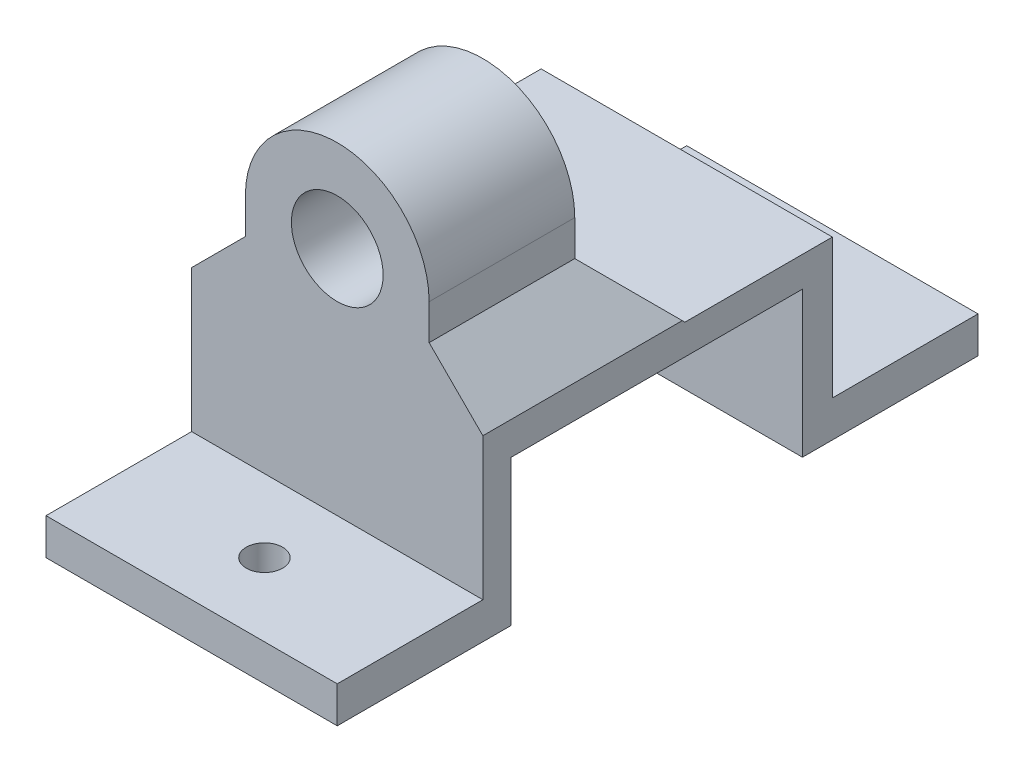
ISO-10303-21;
HEADER;
FILE_DESCRIPTION(('STEP AP214'),'2;1');
FILE_NAME('part.step','',(''),(''),'','','');
FILE_SCHEMA(('AUTOMOTIVE_DESIGN { 1 0 10303 214 1 1 1 1 }'));
ENDSEC;
DATA;
#1=APPLICATION_CONTEXT('core data for automotive mechanical design processes');
#2=APPLICATION_PROTOCOL_DEFINITION('international standard','automotive_design',2000,#1);
#3=PRODUCT_CONTEXT('',#1,'mechanical');
#4=PRODUCT('Part','Part','',(#3));
#5=PRODUCT_RELATED_PRODUCT_CATEGORY('part','',(#4));
#6=PRODUCT_DEFINITION_FORMATION('','',#4);
#7=PRODUCT_DEFINITION_CONTEXT('part definition',#1,'design');
#8=PRODUCT_DEFINITION('design','',#6,#7);
#9=PRODUCT_DEFINITION_SHAPE('','',#8);
#10=(LENGTH_UNIT() NAMED_UNIT(*) SI_UNIT(.MILLI.,.METRE.));
#11=(NAMED_UNIT(*) PLANE_ANGLE_UNIT() SI_UNIT($,.RADIAN.));
#12=(NAMED_UNIT(*) SI_UNIT($,.STERADIAN.) SOLID_ANGLE_UNIT());
#13=UNCERTAINTY_MEASURE_WITH_UNIT(LENGTH_MEASURE(1.E-05),#10,'distance_accuracy_value','');
#14=(GEOMETRIC_REPRESENTATION_CONTEXT(3) GLOBAL_UNCERTAINTY_ASSIGNED_CONTEXT((#13)) GLOBAL_UNIT_ASSIGNED_CONTEXT((#10,
#11,#12)) REPRESENTATION_CONTEXT('',''));
#15=CARTESIAN_POINT('',(0.,0.,0.));
#16=DIRECTION('',(0.,0.,1.));
#17=DIRECTION('',(1.,0.,0.));
#18=AXIS2_PLACEMENT_3D('',#15,#16,#17);
#19=CARTESIAN_POINT('',(25.4,15.4293953995697,-15.3076613058219));
#20=DIRECTION('',(0.,-1.,0.));
#21=DIRECTION('',(0.,0.,-1.));
#22=AXIS2_PLACEMENT_3D('',#19,#20,#21);
#23=PLANE('',#22);
#24=DIRECTION('',(0.,0.,1.));
#25=VECTOR('',#24,1.);
#26=CARTESIAN_POINT('',(0.,15.4293953995697,-15.3076613058219));
#27=LINE('',#26,#25);
#28=CARTESIAN_POINT('',(0.,15.4293953995697,-15.3076613058219));
#29=VERTEX_POINT('',#28);
#30=CARTESIAN_POINT('',(0.,15.4293953995697,-2.44766130582202));
#31=VERTEX_POINT('',#30);
#32=EDGE_CURVE('E278',#29,#31,#27,.T.);
#33=ORIENTED_EDGE('',*,*,#32,.T.);
#34=DIRECTION('',(1.,0.,0.));
#35=VECTOR('',#34,1.);
#36=CARTESIAN_POINT('',(25.4,15.4293953995697,-2.44766130582202));
#37=LINE('',#36,#35);
#38=CARTESIAN_POINT('',(25.4,15.4293953995697,-2.44766130582202));
#39=VERTEX_POINT('',#38);
#40=EDGE_CURVE('E359',#31,#39,#37,.T.);
#41=ORIENTED_EDGE('',*,*,#40,.T.);
#42=DIRECTION('',(0.,0.,1.));
#43=VECTOR('',#42,1.);
#44=CARTESIAN_POINT('',(25.4,15.4293953995697,-15.3076613058219));
#45=LINE('',#44,#43);
#46=CARTESIAN_POINT('',(25.4,15.4293953995697,-15.3076613058219));
#47=VERTEX_POINT('',#46);
#48=EDGE_CURVE('E240',#47,#39,#45,.T.);
#49=ORIENTED_EDGE('',*,*,#48,.F.);
#50=DIRECTION('',(-1.,0.,0.));
#51=VECTOR('',#50,1.);
#52=CARTESIAN_POINT('',(25.4,15.4293953995697,-15.3076613058219));
#53=LINE('',#52,#51);
#54=EDGE_CURVE('E322',#47,#29,#53,.T.);
#55=ORIENTED_EDGE('',*,*,#54,.T.);
#56=EDGE_LOOP('',(#33,#41,#49,#55));
#57=FACE_BOUND('',#56,.T.);
#58=ADVANCED_FACE('F43',(#57),#23,.F.);
#59=CARTESIAN_POINT('',(25.4,12.800996681316,-12.7));
#60=DIRECTION('',(0.,0.,-1.));
#61=DIRECTION('',(0.,1.,0.));
#62=AXIS2_PLACEMENT_3D('',#59,#60,#61);
#63=PLANE('',#62);
#64=DIRECTION('',(0.,-1.,0.));
#65=VECTOR('',#64,1.);
#66=CARTESIAN_POINT('',(0.,12.800996681316,-12.7));
#67=LINE('',#66,#65);
#68=CARTESIAN_POINT('',(0.,12.800996681316,-12.7));
#69=VERTEX_POINT('',#68);
#70=CARTESIAN_POINT('',(0.,0.100996681315959,-12.7));
#71=VERTEX_POINT('',#70);
#72=EDGE_CURVE('E221',#69,#71,#67,.T.);
#73=ORIENTED_EDGE('',*,*,#72,.T.);
#74=DIRECTION('',(-1.,0.,0.));
#75=VECTOR('',#74,1.);
#76=CARTESIAN_POINT('',(25.4,0.100996681315959,-12.7));
#77=LINE('',#76,#75);
#78=CARTESIAN_POINT('',(25.4,0.100996681315959,-12.7));
#79=VERTEX_POINT('',#78);
#80=EDGE_CURVE('E338',#79,#71,#77,.T.);
#81=ORIENTED_EDGE('',*,*,#80,.F.);
#82=DIRECTION('',(0.,-1.,0.));
#83=VECTOR('',#82,1.);
#84=CARTESIAN_POINT('',(25.4,12.800996681316,-12.7));
#85=LINE('',#84,#83);
#86=CARTESIAN_POINT('',(25.4,12.800996681316,-12.7));
#87=VERTEX_POINT('',#86);
#88=EDGE_CURVE('E223',#87,#79,#85,.T.);
#89=ORIENTED_EDGE('',*,*,#88,.F.);
#90=DIRECTION('',(-1.,0.,0.));
#91=VECTOR('',#90,1.);
#92=CARTESIAN_POINT('',(25.4,12.800996681316,-12.7));
#93=LINE('',#92,#91);
#94=EDGE_CURVE('E262',#87,#69,#93,.T.);
#95=ORIENTED_EDGE('',*,*,#94,.T.);
#96=EDGE_LOOP('',(#73,#81,#89,#95));
#97=FACE_BOUND('',#96,.T.);
#98=ADVANCED_FACE('F415',(#97),#63,.F.);
#99=CARTESIAN_POINT('',(25.4,0.100996681315959,-12.7));
#100=DIRECTION('',(0.,1.,0.));
#101=DIRECTION('',(0.,0.,1.));
#102=AXIS2_PLACEMENT_3D('',#99,#100,#101);
#103=PLANE('',#102);
#104=CARTESIAN_POINT('',(12.7,0.100996681315961,-21.6576613058219));
#105=DIRECTION('',(0.,1.,0.));
#106=DIRECTION('',(0.,0.,1.));
#107=AXIS2_PLACEMENT_3D('',#104,#105,#106);
#108=CIRCLE('',#107,1.5875);
#109=CARTESIAN_POINT('',(12.7,0.100996681315961,-20.0701613058219));
#110=VERTEX_POINT('',#109);
#111=EDGE_CURVE('E459',#110,#110,#108,.T.);
#112=ORIENTED_EDGE('',*,*,#111,.T.);
#113=EDGE_LOOP('',(#112));
#114=FACE_BOUND('',#113,.T.);
#115=DIRECTION('',(0.,0.,-1.));
#116=VECTOR('',#115,1.);
#117=CARTESIAN_POINT('',(0.,0.100996681315959,-12.7));
#118=LINE('',#117,#116);
#119=CARTESIAN_POINT('',(0.,0.100996681315963,-28.0076613058219));
#120=VERTEX_POINT('',#119);
#121=EDGE_CURVE('E266',#71,#120,#118,.T.);
#122=ORIENTED_EDGE('',*,*,#121,.T.);
#123=DIRECTION('',(-1.,0.,0.));
#124=VECTOR('',#123,1.);
#125=CARTESIAN_POINT('',(25.4,0.100996681315963,-28.0076613058219));
#126=LINE('',#125,#124);
#127=CARTESIAN_POINT('',(25.4,0.100996681315963,-28.0076613058219));
#128=VERTEX_POINT('',#127);
#129=EDGE_CURVE('E334',#128,#120,#126,.T.);
#130=ORIENTED_EDGE('',*,*,#129,.F.);
#131=DIRECTION('',(0.,0.,-1.));
#132=VECTOR('',#131,1.);
#133=CARTESIAN_POINT('',(25.4,0.100996681315959,-12.7));
#134=LINE('',#133,#132);
#135=EDGE_CURVE('E227',#79,#128,#134,.T.);
#136=ORIENTED_EDGE('',*,*,#135,.F.);
#137=ORIENTED_EDGE('',*,*,#80,.T.);
#138=EDGE_LOOP('',(#122,#130,#136,#137));
#139=FACE_BOUND('',#138,.T.);
#140=ADVANCED_FACE('F410',(#114,#139),#103,.F.);
#141=CARTESIAN_POINT('',(25.4,3.27599668131595,-28.0076613058219));
#142=DIRECTION('',(0.,0.,1.));
#143=DIRECTION('',(1.,0.,0.));
#144=AXIS2_PLACEMENT_3D('',#141,#142,#143);
#145=PLANE('',#144);
#146=DIRECTION('',(0.,1.,0.));
#147=VECTOR('',#146,1.);
#148=CARTESIAN_POINT('',(0.,3.27599668131595,-28.0076613058219));
#149=LINE('',#148,#147);
#150=CARTESIAN_POINT('',(0.,3.27599668131595,-28.0076613058219));
#151=VERTEX_POINT('',#150);
#152=EDGE_CURVE('E269',#120,#151,#149,.T.);
#153=ORIENTED_EDGE('',*,*,#152,.T.);
#154=DIRECTION('',(-1.,0.,0.));
#155=VECTOR('',#154,1.);
#156=CARTESIAN_POINT('',(25.4,3.27599668131595,-28.0076613058219));
#157=LINE('',#156,#155);
#158=CARTESIAN_POINT('',(25.4,3.27599668131595,-28.0076613058219));
#159=VERTEX_POINT('',#158);
#160=EDGE_CURVE('E330',#159,#151,#157,.T.);
#161=ORIENTED_EDGE('',*,*,#160,.F.);
#162=DIRECTION('',(0.,1.,0.));
#163=VECTOR('',#162,1.);
#164=CARTESIAN_POINT('',(25.4,3.27599668131595,-28.0076613058219));
#165=LINE('',#164,#163);
#166=EDGE_CURVE('E231',#128,#159,#165,.T.);
#167=ORIENTED_EDGE('',*,*,#166,.F.);
#168=ORIENTED_EDGE('',*,*,#129,.T.);
#169=EDGE_LOOP('',(#153,#161,#167,#168));
#170=FACE_BOUND('',#169,.T.);
#171=ADVANCED_FACE('F407',(#170),#145,.F.);
#172=CARTESIAN_POINT('',(25.4,3.27599668131595,-15.3076613058219));
#173=DIRECTION('',(0.,-1.,0.));
#174=DIRECTION('',(0.,0.,-1.));
#175=AXIS2_PLACEMENT_3D('',#172,#173,#174);
#176=PLANE('',#175);
#177=CARTESIAN_POINT('',(12.7,3.27599668131595,-21.6576613058219));
#178=DIRECTION('',(0.,1.,0.));
#179=DIRECTION('',(0.,0.,1.));
#180=AXIS2_PLACEMENT_3D('',#177,#178,#179);
#181=CIRCLE('',#180,1.5875);
#182=CARTESIAN_POINT('',(12.7,3.27599668131595,-20.0701613058219));
#183=VERTEX_POINT('',#182);
#184=EDGE_CURVE('E468',#183,#183,#181,.T.);
#185=ORIENTED_EDGE('',*,*,#184,.F.);
#186=EDGE_LOOP('',(#185));
#187=FACE_BOUND('',#186,.T.);
#188=DIRECTION('',(0.,0.,1.));
#189=VECTOR('',#188,1.);
#190=CARTESIAN_POINT('',(0.,3.27599668131595,-15.3076613058219));
#191=LINE('',#190,#189);
#192=CARTESIAN_POINT('',(0.,3.27599668131595,-15.3076613058219));
#193=VERTEX_POINT('',#192);
#194=EDGE_CURVE('E272',#151,#193,#191,.T.);
#195=ORIENTED_EDGE('',*,*,#194,.T.);
#196=DIRECTION('',(-1.,0.,0.));
#197=VECTOR('',#196,1.);
#198=CARTESIAN_POINT('',(25.4,3.27599668131595,-15.3076613058219));
#199=LINE('',#198,#197);
#200=CARTESIAN_POINT('',(25.4,3.27599668131595,-15.3076613058219));
#201=VERTEX_POINT('',#200);
#202=EDGE_CURVE('E326',#201,#193,#199,.T.);
#203=ORIENTED_EDGE('',*,*,#202,.F.);
#204=DIRECTION('',(0.,0.,1.));
#205=VECTOR('',#204,1.);
#206=CARTESIAN_POINT('',(25.4,3.27599668131595,-15.3076613058219));
#207=LINE('',#206,#205);
#208=EDGE_CURVE('E234',#159,#201,#207,.T.);
#209=ORIENTED_EDGE('',*,*,#208,.F.);
#210=ORIENTED_EDGE('',*,*,#160,.T.);
#211=EDGE_LOOP('',(#195,#203,#209,#210));
#212=FACE_BOUND('',#211,.T.);
#213=ADVANCED_FACE('F402',(#187,#212),#176,.F.);
#214=CARTESIAN_POINT('',(25.4,15.4293953995697,-15.3076613058219));
#215=DIRECTION('',(0.,0.,1.));
#216=DIRECTION('',(1.,0.,0.));
#217=AXIS2_PLACEMENT_3D('',#214,#215,#216);
#218=PLANE('',#217);
#219=DIRECTION('',(0.,1.,0.));
#220=VECTOR('',#219,1.);
#221=CARTESIAN_POINT('',(0.,15.4293953995697,-15.3076613058219));
#222=LINE('',#221,#220);
#223=EDGE_CURVE('E275',#193,#29,#222,.T.);
#224=ORIENTED_EDGE('',*,*,#223,.T.);
#225=ORIENTED_EDGE('',*,*,#54,.F.);
#226=DIRECTION('',(0.,1.,0.));
#227=VECTOR('',#226,1.);
#228=CARTESIAN_POINT('',(25.4,15.4293953995697,-15.3076613058219));
#229=LINE('',#228,#227);
#230=EDGE_CURVE('E237',#201,#47,#229,.T.);
#231=ORIENTED_EDGE('',*,*,#230,.F.);
#232=ORIENTED_EDGE('',*,*,#202,.T.);
#233=EDGE_LOOP('',(#224,#225,#231,#232));
#234=FACE_BOUND('',#233,.T.);
#235=ADVANCED_FACE('F397',(#234),#218,.F.);
#236=CARTESIAN_POINT('',(25.4,15.4293953995697,15.1723386941781));
#237=DIRECTION('',(0.,0.,-1.));
#238=DIRECTION('',(-1.,0.,0.));
#239=AXIS2_PLACEMENT_3D('',#236,#237,#238);
#240=PLANE('',#239);
#241=DIRECTION('',(0.,-1.,0.));
#242=VECTOR('',#241,1.);
#243=CARTESIAN_POINT('',(0.,15.4293953995697,15.1723386941781));
#244=LINE('',#243,#242);
#245=CARTESIAN_POINT('',(0.,15.6622744756869,15.1723386941781));
#246=VERTEX_POINT('',#245);
#247=CARTESIAN_POINT('',(0.,3.27599668131595,15.1723386941781));
#248=VERTEX_POINT('',#247);
#249=EDGE_CURVE('E282',#246,#248,#244,.T.);
#250=ORIENTED_EDGE('',*,*,#249,.T.);
#251=DIRECTION('',(-1.,0.,0.));
#252=VECTOR('',#251,1.);
#253=CARTESIAN_POINT('',(25.4,3.27599668131595,15.1723386941781));
#254=LINE('',#253,#252);
#255=CARTESIAN_POINT('',(25.4,3.27599668131595,15.1723386941781));
#256=VERTEX_POINT('',#255);
#257=EDGE_CURVE('E318',#256,#248,#254,.T.);
#258=ORIENTED_EDGE('',*,*,#257,.F.);
#259=DIRECTION('',(0.,-1.,0.));
#260=VECTOR('',#259,1.);
#261=CARTESIAN_POINT('',(25.4,15.4293953995697,15.1723386941781));
#262=LINE('',#261,#260);
#263=CARTESIAN_POINT('',(25.4,15.662274475687,15.1723386941781));
#264=VERTEX_POINT('',#263);
#265=EDGE_CURVE('E244',#264,#256,#262,.T.);
#266=ORIENTED_EDGE('',*,*,#265,.F.);
#267=DIRECTION('',(-0.707106781186552,0.707106781186543,0.));
#268=VECTOR('',#267,1.);
#269=CARTESIAN_POINT('',(25.5164395380586,15.5458349376283,15.1723386941781));
#270=LINE('',#269,#268);
#271=CARTESIAN_POINT('',(20.7128790761172,20.3493953995697,15.1723386941781));
#272=VERTEX_POINT('',#271);
#273=EDGE_CURVE('E356',#264,#272,#270,.T.);
#274=ORIENTED_EDGE('',*,*,#273,.T.);
#275=DIRECTION('',(0.,1.,0.));
#276=VECTOR('',#275,1.);
#277=CARTESIAN_POINT('',(20.7128790761172,23.4422744756869,15.1723386941781));
#278=LINE('',#277,#276);
#279=CARTESIAN_POINT('',(20.7128790761172,23.4422744756869,15.1723386941781));
#280=VERTEX_POINT('',#279);
#281=EDGE_CURVE('E211',#272,#280,#278,.T.);
#282=ORIENTED_EDGE('',*,*,#281,.T.);
#283=CARTESIAN_POINT('',(12.7,23.4422744756869,15.1723386941781));
#284=DIRECTION('',(0.,0.,1.));
#285=DIRECTION('',(1.,0.,0.));
#286=AXIS2_PLACEMENT_3D('',#283,#284,#285);
#287=CIRCLE('',#286,8.01287907611717);
#288=CARTESIAN_POINT('',(4.68712092388283,23.4422744756869,15.1723386941781));
#289=VERTEX_POINT('',#288);
#290=EDGE_CURVE('E197',#280,#289,#287,.T.);
#291=ORIENTED_EDGE('',*,*,#290,.T.);
#292=DIRECTION('',(0.,-1.,0.));
#293=VECTOR('',#292,1.);
#294=CARTESIAN_POINT('',(4.68712092388283,23.4422744756869,15.1723386941781));
#295=LINE('',#294,#293);
#296=CARTESIAN_POINT('',(4.68712092388283,20.3493953995698,15.1723386941781));
#297=VERTEX_POINT('',#296);
#298=EDGE_CURVE('E191',#289,#297,#295,.T.);
#299=ORIENTED_EDGE('',*,*,#298,.T.);
#300=DIRECTION('',(-0.707106781186544,-0.707106781186551,0.));
#301=VECTOR('',#300,1.);
#302=CARTESIAN_POINT('',(12.5835604619413,28.2458349376283,15.1723386941781));
#303=LINE('',#302,#301);
#304=EDGE_CURVE('E348',#297,#246,#303,.T.);
#305=ORIENTED_EDGE('',*,*,#304,.T.);
#306=EDGE_LOOP('',(#250,#258,#266,#274,#282,#291,#299,#305));
#307=FACE_BOUND('',#306,.T.);
#308=CARTESIAN_POINT('',(12.7,23.4422744756869,15.1723386941781));
#309=DIRECTION('',(0.,0.,1.));
#310=DIRECTION('',(1.,0.,0.));
#311=AXIS2_PLACEMENT_3D('',#308,#309,#310);
#312=CIRCLE('',#311,4.);
#313=CARTESIAN_POINT('',(16.7,23.4422744756869,15.1723386941781));
#314=VERTEX_POINT('',#313);
#315=EDGE_CURVE('E455',#314,#314,#312,.T.);
#316=ORIENTED_EDGE('',*,*,#315,.F.);
#317=EDGE_LOOP('',(#316));
#318=FACE_BOUND('',#317,.T.);
#319=ADVANCED_FACE('F442',(#307,#318),#240,.F.);
#320=CARTESIAN_POINT('',(25.4,3.27599668131595,27.8723386941781));
#321=DIRECTION('',(0.,-1.,0.));
#322=DIRECTION('',(0.,0.,-1.));
#323=AXIS2_PLACEMENT_3D('',#320,#321,#322);
#324=PLANE('',#323);
#325=CARTESIAN_POINT('',(12.7,3.27599668131595,21.5223386941781));
#326=DIRECTION('',(0.,1.,0.));
#327=DIRECTION('',(0.,0.,1.));
#328=AXIS2_PLACEMENT_3D('',#325,#326,#327);
#329=CIRCLE('',#328,1.5875);
#330=CARTESIAN_POINT('',(12.7,3.27599668131595,23.1098386941781));
#331=VERTEX_POINT('',#330);
#332=EDGE_CURVE('E464',#331,#331,#329,.T.);
#333=ORIENTED_EDGE('',*,*,#332,.F.);
#334=EDGE_LOOP('',(#333));
#335=FACE_BOUND('',#334,.T.);
#336=DIRECTION('',(0.,0.,1.));
#337=VECTOR('',#336,1.);
#338=CARTESIAN_POINT('',(0.,3.27599668131595,27.8723386941781));
#339=LINE('',#338,#337);
#340=CARTESIAN_POINT('',(0.,3.27599668131595,27.8723386941781));
#341=VERTEX_POINT('',#340);
#342=EDGE_CURVE('E285',#248,#341,#339,.T.);
#343=ORIENTED_EDGE('',*,*,#342,.T.);
#344=DIRECTION('',(-1.,0.,0.));
#345=VECTOR('',#344,1.);
#346=CARTESIAN_POINT('',(25.4,3.27599668131595,27.8723386941781));
#347=LINE('',#346,#345);
#348=CARTESIAN_POINT('',(25.4,3.27599668131595,27.8723386941781));
#349=VERTEX_POINT('',#348);
#350=EDGE_CURVE('E314',#349,#341,#347,.T.);
#351=ORIENTED_EDGE('',*,*,#350,.F.);
#352=DIRECTION('',(0.,0.,1.));
#353=VECTOR('',#352,1.);
#354=CARTESIAN_POINT('',(25.4,3.27599668131595,27.8723386941781));
#355=LINE('',#354,#353);
#356=EDGE_CURVE('E247',#256,#349,#355,.T.);
#357=ORIENTED_EDGE('',*,*,#356,.F.);
#358=ORIENTED_EDGE('',*,*,#257,.T.);
#359=EDGE_LOOP('',(#343,#351,#357,#358));
#360=FACE_BOUND('',#359,.T.);
#361=ADVANCED_FACE('F439',(#335,#360),#324,.F.);
#362=CARTESIAN_POINT('',(25.4,3.27599668131595,27.8723386941781));
#363=DIRECTION('',(0.,0.,-1.));
#364=DIRECTION('',(-1.,0.,0.));
#365=AXIS2_PLACEMENT_3D('',#362,#363,#364);
#366=PLANE('',#365);
#367=DIRECTION('',(0.,-1.,0.));
#368=VECTOR('',#367,1.);
#369=CARTESIAN_POINT('',(0.,3.27599668131595,27.8723386941781));
#370=LINE('',#369,#368);
#371=CARTESIAN_POINT('',(0.,0.100996681315949,27.8723386941781));
#372=VERTEX_POINT('',#371);
#373=EDGE_CURVE('E288',#341,#372,#370,.T.);
#374=ORIENTED_EDGE('',*,*,#373,.T.);
#375=DIRECTION('',(-1.,0.,0.));
#376=VECTOR('',#375,1.);
#377=CARTESIAN_POINT('',(25.4,0.100996681315949,27.8723386941781));
#378=LINE('',#377,#376);
#379=CARTESIAN_POINT('',(25.4,0.100996681315949,27.8723386941781));
#380=VERTEX_POINT('',#379);
#381=EDGE_CURVE('E310',#380,#372,#378,.T.);
#382=ORIENTED_EDGE('',*,*,#381,.F.);
#383=DIRECTION('',(0.,-1.,0.));
#384=VECTOR('',#383,1.);
#385=CARTESIAN_POINT('',(25.4,3.27599668131595,27.8723386941781));
#386=LINE('',#385,#384);
#387=EDGE_CURVE('E250',#349,#380,#386,.T.);
#388=ORIENTED_EDGE('',*,*,#387,.F.);
#389=ORIENTED_EDGE('',*,*,#350,.T.);
#390=EDGE_LOOP('',(#374,#382,#388,#389));
#391=FACE_BOUND('',#390,.T.);
#392=ADVANCED_FACE('F435',(#391),#366,.F.);
#393=CARTESIAN_POINT('',(25.4,0.100996681315949,27.8723386941781));
#394=DIRECTION('',(0.,1.,0.));
#395=DIRECTION('',(0.,0.,1.));
#396=AXIS2_PLACEMENT_3D('',#393,#394,#395);
#397=PLANE('',#396);
#398=CARTESIAN_POINT('',(12.7,0.100996681315951,21.5223386941781));
#399=DIRECTION('',(0.,1.,0.));
#400=DIRECTION('',(0.,0.,1.));
#401=AXIS2_PLACEMENT_3D('',#398,#399,#400);
#402=CIRCLE('',#401,1.5875);
#403=CARTESIAN_POINT('',(12.7,0.10099668131595,23.1098386941781));
#404=VERTEX_POINT('',#403);
#405=EDGE_CURVE('E48',#404,#404,#402,.T.);
#406=ORIENTED_EDGE('',*,*,#405,.T.);
#407=EDGE_LOOP('',(#406));
#408=FACE_BOUND('',#407,.T.);
#409=DIRECTION('',(0.,0.,-1.));
#410=VECTOR('',#409,1.);
#411=CARTESIAN_POINT('',(0.,0.100996681315949,27.8723386941781));
#412=LINE('',#411,#410);
#413=CARTESIAN_POINT('',(0.,0.100996681315952,12.7));
#414=VERTEX_POINT('',#413);
#415=EDGE_CURVE('E291',#372,#414,#412,.T.);
#416=ORIENTED_EDGE('',*,*,#415,.T.);
#417=DIRECTION('',(-1.,0.,0.));
#418=VECTOR('',#417,1.);
#419=CARTESIAN_POINT('',(25.4,0.100996681315952,12.7));
#420=LINE('',#419,#418);
#421=CARTESIAN_POINT('',(25.4,0.100996681315952,12.7));
#422=VERTEX_POINT('',#421);
#423=EDGE_CURVE('E306',#422,#414,#420,.T.);
#424=ORIENTED_EDGE('',*,*,#423,.F.);
#425=DIRECTION('',(0.,0.,-1.));
#426=VECTOR('',#425,1.);
#427=CARTESIAN_POINT('',(25.4,0.100996681315949,27.8723386941781));
#428=LINE('',#427,#426);
#429=EDGE_CURVE('E253',#380,#422,#428,.T.);
#430=ORIENTED_EDGE('',*,*,#429,.F.);
#431=ORIENTED_EDGE('',*,*,#381,.T.);
#432=EDGE_LOOP('',(#416,#424,#430,#431));
#433=FACE_BOUND('',#432,.T.);
#434=ADVANCED_FACE('F430',(#408,#433),#397,.F.);
#435=CARTESIAN_POINT('',(25.4,12.800996681316,12.7));
#436=DIRECTION('',(0.,0.,1.));
#437=DIRECTION('',(0.,-1.,0.));
#438=AXIS2_PLACEMENT_3D('',#435,#436,#437);
#439=PLANE('',#438);
#440=DIRECTION('',(0.,1.,0.));
#441=VECTOR('',#440,1.);
#442=CARTESIAN_POINT('',(0.,12.800996681316,12.7));
#443=LINE('',#442,#441);
#444=CARTESIAN_POINT('',(0.,12.800996681316,12.7));
#445=VERTEX_POINT('',#444);
#446=EDGE_CURVE('E294',#414,#445,#443,.T.);
#447=ORIENTED_EDGE('',*,*,#446,.T.);
#448=DIRECTION('',(-1.,0.,0.));
#449=VECTOR('',#448,1.);
#450=CARTESIAN_POINT('',(25.4,12.800996681316,12.7));
#451=LINE('',#450,#449);
#452=CARTESIAN_POINT('',(25.4,12.800996681316,12.7));
#453=VERTEX_POINT('',#452);
#454=EDGE_CURVE('E302',#453,#445,#451,.T.);
#455=ORIENTED_EDGE('',*,*,#454,.F.);
#456=DIRECTION('',(0.,1.,0.));
#457=VECTOR('',#456,1.);
#458=CARTESIAN_POINT('',(25.4,12.800996681316,12.7));
#459=LINE('',#458,#457);
#460=EDGE_CURVE('E256',#422,#453,#459,.T.);
#461=ORIENTED_EDGE('',*,*,#460,.F.);
#462=ORIENTED_EDGE('',*,*,#423,.T.);
#463=EDGE_LOOP('',(#447,#455,#461,#462));
#464=FACE_BOUND('',#463,.T.);
#465=ADVANCED_FACE('F424',(#464),#439,.F.);
#466=CARTESIAN_POINT('',(25.4,12.800996681316,-12.7));
#467=DIRECTION('',(0.,1.,0.));
#468=DIRECTION('',(0.,0.,1.));
#469=AXIS2_PLACEMENT_3D('',#466,#467,#468);
#470=PLANE('',#469);
#471=DIRECTION('',(0.,0.,-1.));
#472=VECTOR('',#471,1.);
#473=CARTESIAN_POINT('',(0.,12.800996681316,-12.7));
#474=LINE('',#473,#472);
#475=EDGE_CURVE('E228',#445,#69,#474,.T.);
#476=ORIENTED_EDGE('',*,*,#475,.T.);
#477=ORIENTED_EDGE('',*,*,#94,.F.);
#478=DIRECTION('',(0.,0.,-1.));
#479=VECTOR('',#478,1.);
#480=CARTESIAN_POINT('',(25.4,12.800996681316,-12.7));
#481=LINE('',#480,#479);
#482=EDGE_CURVE('E259',#453,#87,#481,.T.);
#483=ORIENTED_EDGE('',*,*,#482,.F.);
#484=ORIENTED_EDGE('',*,*,#454,.T.);
#485=EDGE_LOOP('',(#476,#477,#483,#484));
#486=FACE_BOUND('',#485,.T.);
#487=ADVANCED_FACE('F420',(#486),#470,.F.);
#488=CARTESIAN_POINT('',(25.4,0.,0.));
#489=DIRECTION('',(1.,0.,0.));
#490=DIRECTION('',(0.,0.,-1.));
#491=AXIS2_PLACEMENT_3D('',#488,#489,#490);
#492=PLANE('',#491);
#493=ORIENTED_EDGE('',*,*,#88,.T.);
#494=ORIENTED_EDGE('',*,*,#135,.T.);
#495=ORIENTED_EDGE('',*,*,#166,.T.);
#496=ORIENTED_EDGE('',*,*,#208,.T.);
#497=ORIENTED_EDGE('',*,*,#230,.T.);
#498=ORIENTED_EDGE('',*,*,#48,.T.);
#499=DIRECTION('',(0.,-0.707106781186544,-0.707106781186551));
#500=VECTOR('',#499,1.);
#501=CARTESIAN_POINT('',(25.4,15.4293953995697,-2.44766130582202));
#502=LINE('',#501,#500);
#503=CARTESIAN_POINT('',(25.4,15.662274475687,-2.21478222970477));
#504=VERTEX_POINT('',#503);
#505=EDGE_CURVE('E369',#39,#504,#502,.F.);
#506=ORIENTED_EDGE('',*,*,#505,.T.);
#507=DIRECTION('',(0.,0.,1.));
#508=VECTOR('',#507,1.);
#509=CARTESIAN_POINT('',(25.4,15.662274475687,-15.3076613058219));
#510=LINE('',#509,#508);
#511=EDGE_CURVE('E68',#504,#264,#510,.T.);
#512=ORIENTED_EDGE('',*,*,#511,.T.);
#513=ORIENTED_EDGE('',*,*,#265,.T.);
#514=ORIENTED_EDGE('',*,*,#356,.T.);
#515=ORIENTED_EDGE('',*,*,#387,.T.);
#516=ORIENTED_EDGE('',*,*,#429,.T.);
#517=ORIENTED_EDGE('',*,*,#460,.T.);
#518=ORIENTED_EDGE('',*,*,#482,.T.);
#519=EDGE_LOOP('',(#493,#494,#495,#496,#497,#498,#506,#512,#513,#514,#515,#516,#517,#518));
#520=FACE_BOUND('',#519,.T.);
#521=ADVANCED_FACE('F586',(#520),#492,.T.);
#522=CARTESIAN_POINT('',(0.,0.,0.));
#523=DIRECTION('',(1.,0.,0.));
#524=DIRECTION('',(0.,0.,-1.));
#525=AXIS2_PLACEMENT_3D('',#522,#523,#524);
#526=PLANE('',#525);
#527=ORIENTED_EDGE('',*,*,#72,.F.);
#528=ORIENTED_EDGE('',*,*,#475,.F.);
#529=ORIENTED_EDGE('',*,*,#446,.F.);
#530=ORIENTED_EDGE('',*,*,#415,.F.);
#531=ORIENTED_EDGE('',*,*,#373,.F.);
#532=ORIENTED_EDGE('',*,*,#342,.F.);
#533=ORIENTED_EDGE('',*,*,#249,.F.);
#534=DIRECTION('',(0.,0.,-1.));
#535=VECTOR('',#534,1.);
#536=CARTESIAN_POINT('',(0.,15.6622744756869,0.));
#537=LINE('',#536,#535);
#538=CARTESIAN_POINT('',(0.,15.6622744756869,-2.21478222970481));
#539=VERTEX_POINT('',#538);
#540=EDGE_CURVE('E60',#246,#539,#537,.T.);
#541=ORIENTED_EDGE('',*,*,#540,.T.);
#542=DIRECTION('',(0.,0.707106781186544,0.707106781186551));
#543=VECTOR('',#542,1.);
#544=CARTESIAN_POINT('',(0.,8.93852835269595,-8.93852835269586));
#545=LINE('',#544,#543);
#546=EDGE_CURVE('E11',#539,#31,#545,.F.);
#547=ORIENTED_EDGE('',*,*,#546,.T.);
#548=ORIENTED_EDGE('',*,*,#32,.F.);
#549=ORIENTED_EDGE('',*,*,#223,.F.);
#550=ORIENTED_EDGE('',*,*,#194,.F.);
#551=ORIENTED_EDGE('',*,*,#152,.F.);
#552=ORIENTED_EDGE('',*,*,#121,.F.);
#553=EDGE_LOOP('',(#527,#528,#529,#530,#531,#532,#533,#541,#547,#548,#549,#550,#551,#552));
#554=FACE_BOUND('',#553,.T.);
#555=ADVANCED_FACE('F390',(#554),#526,.F.);
#556=CARTESIAN_POINT('',(20.7128790761172,23.4422744756869,2.47233869417806));
#557=DIRECTION('',(1.,0.,0.));
#558=DIRECTION('',(0.,0.,-1.));
#559=AXIS2_PLACEMENT_3D('',#556,#557,#558);
#560=PLANE('',#559);
#561=ORIENTED_EDGE('',*,*,#281,.F.);
#562=DIRECTION('',(0.,0.,-1.));
#563=VECTOR('',#562,1.);
#564=CARTESIAN_POINT('',(20.7128790761172,20.3493953995697,2.47233869417806));
#565=LINE('',#564,#563);
#566=CARTESIAN_POINT('',(20.7128790761172,20.3493953995697,2.47233869417806));
#567=VERTEX_POINT('',#566);
#568=EDGE_CURVE('E185',#272,#567,#565,.T.);
#569=ORIENTED_EDGE('',*,*,#568,.T.);
#570=DIRECTION('',(0.,1.,0.));
#571=VECTOR('',#570,1.);
#572=CARTESIAN_POINT('',(20.7128790761172,23.4422744756869,2.47233869417806));
#573=LINE('',#572,#571);
#574=CARTESIAN_POINT('',(20.7128790761172,23.4422744756869,2.47233869417806));
#575=VERTEX_POINT('',#574);
#576=EDGE_CURVE('E178',#567,#575,#573,.T.);
#577=ORIENTED_EDGE('',*,*,#576,.T.);
#578=DIRECTION('',(0.,0.,1.));
#579=VECTOR('',#578,1.);
#580=CARTESIAN_POINT('',(20.7128790761172,23.4422744756869,2.47233869417806));
#581=LINE('',#580,#579);
#582=EDGE_CURVE('E182',#575,#280,#581,.T.);
#583=ORIENTED_EDGE('',*,*,#582,.T.);
#584=EDGE_LOOP('',(#561,#569,#577,#583));
#585=FACE_BOUND('',#584,.T.);
#586=ADVANCED_FACE('F181',(#585),#560,.T.);
#587=CARTESIAN_POINT('',(4.68712092388283,23.4422744756869,2.47233869417806));
#588=DIRECTION('',(-1.,0.,0.));
#589=DIRECTION('',(0.,-1.,0.));
#590=AXIS2_PLACEMENT_3D('',#587,#588,#589);
#591=PLANE('',#590);
#592=DIRECTION('',(0.,-1.,0.));
#593=VECTOR('',#592,1.);
#594=CARTESIAN_POINT('',(4.68712092388283,23.4422744756869,2.47233869417806));
#595=LINE('',#594,#593);
#596=CARTESIAN_POINT('',(4.68712092388283,23.4422744756869,2.47233869417806));
#597=VERTEX_POINT('',#596);
#598=CARTESIAN_POINT('',(4.68712092388283,20.3493953995698,2.47233869417806));
#599=VERTEX_POINT('',#598);
#600=EDGE_CURVE('E200',#597,#599,#595,.T.);
#601=ORIENTED_EDGE('',*,*,#600,.T.);
#602=DIRECTION('',(0.,0.,1.));
#603=VECTOR('',#602,1.);
#604=CARTESIAN_POINT('',(4.68712092388283,20.3493953995698,2.47233869417806));
#605=LINE('',#604,#603);
#606=EDGE_CURVE('E342',#599,#297,#605,.T.);
#607=ORIENTED_EDGE('',*,*,#606,.T.);
#608=ORIENTED_EDGE('',*,*,#298,.F.);
#609=DIRECTION('',(0.,0.,1.));
#610=VECTOR('',#609,1.);
#611=CARTESIAN_POINT('',(4.68712092388283,23.4422744756869,2.47233869417806));
#612=LINE('',#611,#610);
#613=EDGE_CURVE('E199',#597,#289,#612,.T.);
#614=ORIENTED_EDGE('',*,*,#613,.F.);
#615=EDGE_LOOP('',(#601,#607,#608,#614));
#616=FACE_BOUND('',#615,.T.);
#617=ADVANCED_FACE('F446',(#616),#591,.T.);
#618=CARTESIAN_POINT('',(12.7,23.4422744756869,2.47233869417806));
#619=DIRECTION('',(0.,0.,1.));
#620=DIRECTION('',(1.,0.,0.));
#621=AXIS2_PLACEMENT_3D('',#618,#619,#620);
#622=CYLINDRICAL_SURFACE('',#621,8.01287907611717);
#623=ORIENTED_EDGE('',*,*,#290,.F.);
#624=ORIENTED_EDGE('',*,*,#582,.F.);
#625=CARTESIAN_POINT('',(12.7,23.4422744756869,2.47233869417806));
#626=DIRECTION('',(0.,0.,1.));
#627=DIRECTION('',(1.,0.,0.));
#628=AXIS2_PLACEMENT_3D('',#625,#626,#627);
#629=CIRCLE('',#628,8.01287907611717);
#630=EDGE_CURVE('E190',#575,#597,#629,.T.);
#631=ORIENTED_EDGE('',*,*,#630,.T.);
#632=ORIENTED_EDGE('',*,*,#613,.T.);
#633=EDGE_LOOP('',(#623,#624,#631,#632));
#634=FACE_BOUND('',#633,.T.);
#635=ADVANCED_FACE('F195',(#634),#622,.T.);
#636=CARTESIAN_POINT('',(12.7,23.4422744756869,2.47233869417806));
#637=DIRECTION('',(0.,0.,1.));
#638=DIRECTION('',(1.,0.,0.));
#639=AXIS2_PLACEMENT_3D('',#636,#637,#638);
#640=PLANE('',#639);
#641=ORIENTED_EDGE('',*,*,#576,.F.);
#642=DIRECTION('',(-1.,0.,0.));
#643=VECTOR('',#642,1.);
#644=CARTESIAN_POINT('',(0.,20.3493953995697,2.47233869417806));
#645=LINE('',#644,#643);
#646=CARTESIAN_POINT('',(15.2365525857977,20.3493953995697,2.47233869417806));
#647=VERTEX_POINT('',#646);
#648=EDGE_CURVE('E366',#567,#647,#645,.T.);
#649=ORIENTED_EDGE('',*,*,#648,.T.);
#650=CARTESIAN_POINT('',(12.7,23.4422744756869,2.47233869417806));
#651=DIRECTION('',(0.,0.,1.));
#652=DIRECTION('',(1.,0.,0.));
#653=AXIS2_PLACEMENT_3D('',#650,#651,#652);
#654=CIRCLE('',#653,4.);
#655=CARTESIAN_POINT('',(10.1634474142023,20.3493953995697,2.47233869417806));
#656=VERTEX_POINT('',#655);
#657=EDGE_CURVE('E214',#647,#656,#654,.T.);
#658=ORIENTED_EDGE('',*,*,#657,.T.);
#659=DIRECTION('',(-1.,0.,0.));
#660=VECTOR('',#659,1.);
#661=CARTESIAN_POINT('',(0.,20.3493953995697,2.47233869417806));
#662=LINE('',#661,#660);
#663=EDGE_CURVE('E363',#656,#599,#662,.T.);
#664=ORIENTED_EDGE('',*,*,#663,.T.);
#665=ORIENTED_EDGE('',*,*,#600,.F.);
#666=ORIENTED_EDGE('',*,*,#630,.F.);
#667=EDGE_LOOP('',(#641,#649,#658,#664,#665,#666));
#668=FACE_BOUND('',#667,.T.);
#669=ADVANCED_FACE('F203',(#668),#640,.F.);
#670=CARTESIAN_POINT('',(12.7,23.4422744756869,2.47233869417806));
#671=DIRECTION('',(0.,0.,1.));
#672=DIRECTION('',(1.,0.,0.));
#673=AXIS2_PLACEMENT_3D('',#670,#671,#672);
#674=CYLINDRICAL_SURFACE('',#673,4.);
#675=ORIENTED_EDGE('',*,*,#657,.F.);
#676=CARTESIAN_POINT('',(12.7,23.4422744756869,5.56521777029524));
#677=DIRECTION('',(0.,0.707106781186551,-0.707106781186544));
#678=DIRECTION('',(0.,0.707106781186544,0.707106781186551));
#679=AXIS2_PLACEMENT_3D('',#676,#677,#678);
#680=ELLIPSE('',#679,5.65685424949241,4.);
#681=EDGE_CURVE('E375',#647,#656,#680,.T.);
#682=ORIENTED_EDGE('',*,*,#681,.T.);
#683=EDGE_LOOP('',(#675,#682));
#684=FACE_BOUND('',#683,.T.);
#685=ORIENTED_EDGE('',*,*,#315,.T.);
#686=EDGE_LOOP('',(#685));
#687=FACE_BOUND('',#686,.T.);
#688=ADVANCED_FACE('F452',(#684,#687),#674,.F.);
#689=CARTESIAN_POINT('',(4.68712092388283,20.3493953995698,2.47233869417806));
#690=DIRECTION('',(0.707106781186551,-0.707106781186544,0.));
#691=DIRECTION('',(0.,0.,1.));
#692=AXIS2_PLACEMENT_3D('',#689,#690,#691);
#693=PLANE('',#692);
#694=ORIENTED_EDGE('',*,*,#606,.F.);
#695=DIRECTION('',(0.57735026918962,0.577350269189625,0.577350269189632));
#696=VECTOR('',#695,1.);
#697=CARTESIAN_POINT('',(4.68712092388283,20.3493953995698,2.47233869417806));
#698=LINE('',#697,#696);
#699=EDGE_CURVE('E54',#599,#539,#698,.F.);
#700=ORIENTED_EDGE('',*,*,#699,.T.);
#701=ORIENTED_EDGE('',*,*,#540,.F.);
#702=ORIENTED_EDGE('',*,*,#304,.F.);
#703=EDGE_LOOP('',(#694,#700,#701,#702));
#704=FACE_BOUND('',#703,.T.);
#705=ADVANCED_FACE('F383',(#704),#693,.F.);
#706=CARTESIAN_POINT('',(25.6328790761173,15.4293953995697,-15.3076613058219));
#707=DIRECTION('',(-0.707106781186543,-0.707106781186552,0.));
#708=DIRECTION('',(0.,0.,1.));
#709=AXIS2_PLACEMENT_3D('',#706,#707,#708);
#710=PLANE('',#709);
#711=ORIENTED_EDGE('',*,*,#511,.F.);
#712=DIRECTION('',(0.577350269189628,-0.577350269189621,-0.577350269189628));
#713=VECTOR('',#712,1.);
#714=CARTESIAN_POINT('',(29.9195457427839,11.1427287329031,-6.73432797248869));
#715=LINE('',#714,#713);
#716=EDGE_CURVE('E372',#504,#567,#715,.F.);
#717=ORIENTED_EDGE('',*,*,#716,.T.);
#718=ORIENTED_EDGE('',*,*,#568,.F.);
#719=ORIENTED_EDGE('',*,*,#273,.F.);
#720=EDGE_LOOP('',(#711,#717,#718,#719));
#721=FACE_BOUND('',#720,.T.);
#722=ADVANCED_FACE('F447',(#721),#710,.F.);
#723=CARTESIAN_POINT('',(25.4,15.4293953995697,-2.44766130582202));
#724=DIRECTION('',(0.,0.707106781186551,-0.707106781186544));
#725=DIRECTION('',(-1.,0.,0.));
#726=AXIS2_PLACEMENT_3D('',#723,#724,#725);
#727=PLANE('',#726);
#728=ORIENTED_EDGE('',*,*,#681,.F.);
#729=ORIENTED_EDGE('',*,*,#648,.F.);
#730=ORIENTED_EDGE('',*,*,#716,.F.);
#731=ORIENTED_EDGE('',*,*,#505,.F.);
#732=ORIENTED_EDGE('',*,*,#40,.F.);
#733=ORIENTED_EDGE('',*,*,#546,.F.);
#734=ORIENTED_EDGE('',*,*,#699,.F.);
#735=ORIENTED_EDGE('',*,*,#663,.F.);
#736=EDGE_LOOP('',(#728,#729,#730,#731,#732,#733,#734,#735));
#737=FACE_BOUND('',#736,.T.);
#738=ADVANCED_FACE('F46',(#737),#727,.T.);
#739=CARTESIAN_POINT('',(12.7,-9.42400331868405,21.5223386941781));
#740=DIRECTION('',(0.,1.,0.));
#741=DIRECTION('',(0.,0.,1.));
#742=AXIS2_PLACEMENT_3D('',#739,#740,#741);
#743=CYLINDRICAL_SURFACE('',#742,1.5875);
#744=ORIENTED_EDGE('',*,*,#332,.T.);
#745=EDGE_LOOP('',(#744));
#746=FACE_BOUND('',#745,.T.);
#747=ORIENTED_EDGE('',*,*,#405,.F.);
#748=EDGE_LOOP('',(#747));
#749=FACE_BOUND('',#748,.T.);
#750=ADVANCED_FACE('F478',(#746,#749),#743,.F.);
#751=CARTESIAN_POINT('',(12.7,-9.42400331868405,-21.6576613058219));
#752=DIRECTION('',(0.,1.,0.));
#753=DIRECTION('',(0.,0.,1.));
#754=AXIS2_PLACEMENT_3D('',#751,#752,#753);
#755=CYLINDRICAL_SURFACE('',#754,1.5875);
#756=ORIENTED_EDGE('',*,*,#184,.T.);
#757=EDGE_LOOP('',(#756));
#758=FACE_BOUND('',#757,.T.);
#759=ORIENTED_EDGE('',*,*,#111,.F.);
#760=EDGE_LOOP('',(#759));
#761=FACE_BOUND('',#760,.T.);
#762=ADVANCED_FACE('F480',(#758,#761),#755,.F.);
#763=CLOSED_SHELL('',(#58,#98,#140,#171,#213,#235,#319,#361,#392,#434,#465,#487,#521,#555,#586,
#617,#635,#669,#688,#705,#722,#738,#750,#762));
#764=MANIFOLD_SOLID_BREP('B2',#763);
#765=ADVANCED_BREP_SHAPE_REPRESENTATION('',(#18,#764),#14);
#766=SHAPE_DEFINITION_REPRESENTATION(#9,#765);
ENDSEC;
END-ISO-10303-21;
